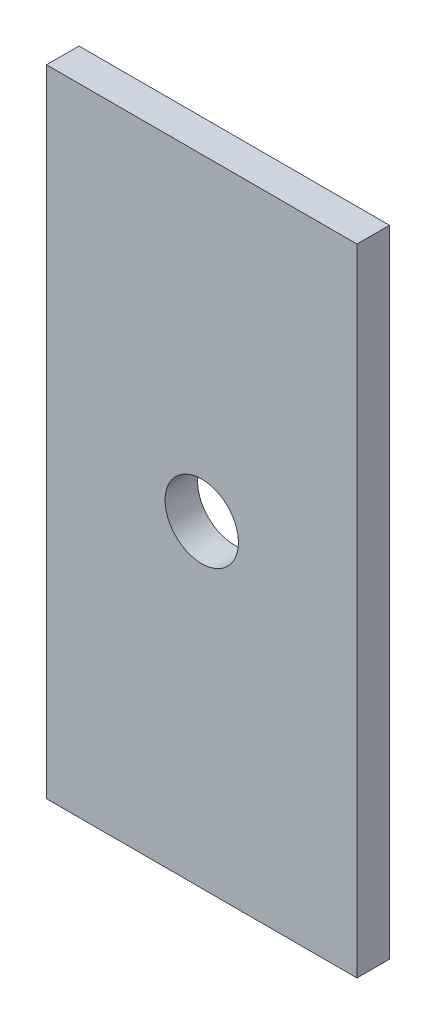
ISO-10303-21;
HEADER;
FILE_DESCRIPTION(('STEP AP214'),'2;1');
FILE_NAME('part.step','',(''),(''),'','','');
FILE_SCHEMA(('AUTOMOTIVE_DESIGN { 1 0 10303 214 1 1 1 1 }'));
ENDSEC;
DATA;
#1=APPLICATION_CONTEXT('core data for automotive mechanical design processes');
#2=APPLICATION_PROTOCOL_DEFINITION('international standard','automotive_design',2000,#1);
#3=PRODUCT_CONTEXT('',#1,'mechanical');
#4=PRODUCT('Part','Part','',(#3));
#5=PRODUCT_RELATED_PRODUCT_CATEGORY('part','',(#4));
#6=PRODUCT_DEFINITION_FORMATION('','',#4);
#7=PRODUCT_DEFINITION_CONTEXT('part definition',#1,'design');
#8=PRODUCT_DEFINITION('design','',#6,#7);
#9=PRODUCT_DEFINITION_SHAPE('','',#8);
#10=(LENGTH_UNIT() NAMED_UNIT(*) SI_UNIT(.MILLI.,.METRE.));
#11=(NAMED_UNIT(*) PLANE_ANGLE_UNIT() SI_UNIT($,.RADIAN.));
#12=(NAMED_UNIT(*) SI_UNIT($,.STERADIAN.) SOLID_ANGLE_UNIT());
#13=UNCERTAINTY_MEASURE_WITH_UNIT(LENGTH_MEASURE(1.E-05),#10,'distance_accuracy_value','');
#14=(GEOMETRIC_REPRESENTATION_CONTEXT(3) GLOBAL_UNCERTAINTY_ASSIGNED_CONTEXT((#13)) GLOBAL_UNIT_ASSIGNED_CONTEXT((#10,
#11,#12)) REPRESENTATION_CONTEXT('',''));
#15=CARTESIAN_POINT('',(0.,0.,0.));
#16=DIRECTION('',(0.,0.,1.));
#17=DIRECTION('',(1.,0.,0.));
#18=AXIS2_PLACEMENT_3D('',#15,#16,#17);
#19=CARTESIAN_POINT('',(0.,0.,2.66));
#20=DIRECTION('',(1.,0.,0.));
#21=DIRECTION('',(0.,1.,0.));
#22=AXIS2_PLACEMENT_3D('',#19,#20,#21);
#23=PLANE('',#22);
#24=DIRECTION('',(0.,-1.,0.));
#25=VECTOR('',#24,1.);
#26=CARTESIAN_POINT('',(0.,0.,0.));
#27=LINE('',#26,#25);
#28=CARTESIAN_POINT('',(0.,52.,0.));
#29=VERTEX_POINT('',#28);
#30=CARTESIAN_POINT('',(0.,0.,0.));
#31=VERTEX_POINT('',#30);
#32=EDGE_CURVE('E106',#29,#31,#27,.T.);
#33=ORIENTED_EDGE('',*,*,#32,.T.);
#34=DIRECTION('',(0.,0.,-1.));
#35=VECTOR('',#34,1.);
#36=CARTESIAN_POINT('',(0.,0.,2.66));
#37=LINE('',#36,#35);
#38=CARTESIAN_POINT('',(0.,0.,2.66));
#39=VERTEX_POINT('',#38);
#40=EDGE_CURVE('E11',#39,#31,#37,.T.);
#41=ORIENTED_EDGE('',*,*,#40,.F.);
#42=DIRECTION('',(0.,-1.,0.));
#43=VECTOR('',#42,1.);
#44=CARTESIAN_POINT('',(0.,0.,2.66));
#45=LINE('',#44,#43);
#46=CARTESIAN_POINT('',(0.,52.,2.66));
#47=VERTEX_POINT('',#46);
#48=EDGE_CURVE('E94',#47,#39,#45,.T.);
#49=ORIENTED_EDGE('',*,*,#48,.F.);
#50=DIRECTION('',(0.,0.,-1.));
#51=VECTOR('',#50,1.);
#52=CARTESIAN_POINT('',(0.,52.,2.66));
#53=LINE('',#52,#51);
#54=EDGE_CURVE('E102',#47,#29,#53,.T.);
#55=ORIENTED_EDGE('',*,*,#54,.T.);
#56=EDGE_LOOP('',(#33,#41,#49,#55));
#57=FACE_BOUND('',#56,.T.);
#58=ADVANCED_FACE('F43',(#57),#23,.F.);
#59=CARTESIAN_POINT('',(0.,0.,2.66));
#60=DIRECTION('',(0.,1.,0.));
#61=DIRECTION('',(0.,0.,1.));
#62=AXIS2_PLACEMENT_3D('',#59,#60,#61);
#63=PLANE('',#62);
#64=DIRECTION('',(1.,0.,0.));
#65=VECTOR('',#64,1.);
#66=CARTESIAN_POINT('',(0.,0.,0.));
#67=LINE('',#66,#65);
#68=CARTESIAN_POINT('',(25.4,0.,0.));
#69=VERTEX_POINT('',#68);
#70=EDGE_CURVE('E98',#31,#69,#67,.T.);
#71=ORIENTED_EDGE('',*,*,#70,.T.);
#72=DIRECTION('',(0.,0.,-1.));
#73=VECTOR('',#72,1.);
#74=CARTESIAN_POINT('',(25.4,0.,2.66));
#75=LINE('',#74,#73);
#76=CARTESIAN_POINT('',(25.4,0.,2.66));
#77=VERTEX_POINT('',#76);
#78=EDGE_CURVE('E51',#77,#69,#75,.T.);
#79=ORIENTED_EDGE('',*,*,#78,.F.);
#80=DIRECTION('',(1.,0.,0.));
#81=VECTOR('',#80,1.);
#82=CARTESIAN_POINT('',(0.,0.,2.66));
#83=LINE('',#82,#81);
#84=EDGE_CURVE('E89',#39,#77,#83,.T.);
#85=ORIENTED_EDGE('',*,*,#84,.F.);
#86=ORIENTED_EDGE('',*,*,#40,.T.);
#87=EDGE_LOOP('',(#71,#79,#85,#86));
#88=FACE_BOUND('',#87,.T.);
#89=ADVANCED_FACE('F97',(#88),#63,.F.);
#90=CARTESIAN_POINT('',(25.4,0.,2.66));
#91=DIRECTION('',(-1.,0.,0.));
#92=DIRECTION('',(0.,-1.,0.));
#93=AXIS2_PLACEMENT_3D('',#90,#91,#92);
#94=PLANE('',#93);
#95=DIRECTION('',(0.,1.,0.));
#96=VECTOR('',#95,1.);
#97=CARTESIAN_POINT('',(25.4,0.,0.));
#98=LINE('',#97,#96);
#99=CARTESIAN_POINT('',(25.4,52.,0.));
#100=VERTEX_POINT('',#99);
#101=EDGE_CURVE('E76',#69,#100,#98,.T.);
#102=ORIENTED_EDGE('',*,*,#101,.T.);
#103=DIRECTION('',(0.,0.,-1.));
#104=VECTOR('',#103,1.);
#105=CARTESIAN_POINT('',(25.4,52.,2.66));
#106=LINE('',#105,#104);
#107=CARTESIAN_POINT('',(25.4,52.,2.66));
#108=VERTEX_POINT('',#107);
#109=EDGE_CURVE('E99',#108,#100,#106,.T.);
#110=ORIENTED_EDGE('',*,*,#109,.F.);
#111=DIRECTION('',(0.,1.,0.));
#112=VECTOR('',#111,1.);
#113=CARTESIAN_POINT('',(25.4,0.,2.66));
#114=LINE('',#113,#112);
#115=EDGE_CURVE('E92',#77,#108,#114,.T.);
#116=ORIENTED_EDGE('',*,*,#115,.F.);
#117=ORIENTED_EDGE('',*,*,#78,.T.);
#118=EDGE_LOOP('',(#102,#110,#116,#117));
#119=FACE_BOUND('',#118,.T.);
#120=ADVANCED_FACE('F100',(#119),#94,.F.);
#121=CARTESIAN_POINT('',(0.,52.,2.66));
#122=DIRECTION('',(0.,-1.,0.));
#123=DIRECTION('',(0.,0.,-1.));
#124=AXIS2_PLACEMENT_3D('',#121,#122,#123);
#125=PLANE('',#124);
#126=DIRECTION('',(-1.,0.,0.));
#127=VECTOR('',#126,1.);
#128=CARTESIAN_POINT('',(0.,52.,0.));
#129=LINE('',#128,#127);
#130=EDGE_CURVE('E82',#100,#29,#129,.T.);
#131=ORIENTED_EDGE('',*,*,#130,.T.);
#132=ORIENTED_EDGE('',*,*,#54,.F.);
#133=DIRECTION('',(-1.,0.,0.));
#134=VECTOR('',#133,1.);
#135=CARTESIAN_POINT('',(0.,52.,2.66));
#136=LINE('',#135,#134);
#137=EDGE_CURVE('E59',#108,#47,#136,.T.);
#138=ORIENTED_EDGE('',*,*,#137,.F.);
#139=ORIENTED_EDGE('',*,*,#109,.T.);
#140=EDGE_LOOP('',(#131,#132,#138,#139));
#141=FACE_BOUND('',#140,.T.);
#142=ADVANCED_FACE('F114',(#141),#125,.F.);
#143=CARTESIAN_POINT('',(0.,0.,2.66));
#144=DIRECTION('',(0.,0.,-1.));
#145=DIRECTION('',(-1.,0.,0.));
#146=AXIS2_PLACEMENT_3D('',#143,#144,#145);
#147=PLANE('',#146);
#148=CARTESIAN_POINT('',(12.7,26.,2.66));
#149=DIRECTION('',(0.,0.,-1.));
#150=DIRECTION('',(-1.,0.,0.));
#151=AXIS2_PLACEMENT_3D('',#148,#149,#150);
#152=CIRCLE('',#151,3.);
#153=CARTESIAN_POINT('',(9.69999999999999,26.,2.66));
#154=VERTEX_POINT('',#153);
#155=EDGE_CURVE('E109',#154,#154,#152,.T.);
#156=ORIENTED_EDGE('',*,*,#155,.T.);
#157=EDGE_LOOP('',(#156));
#158=FACE_BOUND('',#157,.T.);
#159=ORIENTED_EDGE('',*,*,#48,.T.);
#160=ORIENTED_EDGE('',*,*,#84,.T.);
#161=ORIENTED_EDGE('',*,*,#115,.T.);
#162=ORIENTED_EDGE('',*,*,#137,.T.);
#163=EDGE_LOOP('',(#159,#160,#161,#162));
#164=FACE_BOUND('',#163,.T.);
#165=ADVANCED_FACE('F90',(#158,#164),#147,.F.);
#166=CARTESIAN_POINT('',(0.,0.,0.));
#167=DIRECTION('',(0.,0.,-1.));
#168=DIRECTION('',(-1.,0.,0.));
#169=AXIS2_PLACEMENT_3D('',#166,#167,#168);
#170=PLANE('',#169);
#171=CARTESIAN_POINT('',(12.7,26.,0.));
#172=DIRECTION('',(0.,0.,-1.));
#173=DIRECTION('',(-1.,0.,0.));
#174=AXIS2_PLACEMENT_3D('',#171,#172,#173);
#175=CIRCLE('',#174,3.);
#176=CARTESIAN_POINT('',(9.69999999999999,26.,0.));
#177=VERTEX_POINT('',#176);
#178=EDGE_CURVE('E122',#177,#177,#175,.T.);
#179=ORIENTED_EDGE('',*,*,#178,.F.);
#180=EDGE_LOOP('',(#179));
#181=FACE_BOUND('',#180,.T.);
#182=ORIENTED_EDGE('',*,*,#32,.F.);
#183=ORIENTED_EDGE('',*,*,#130,.F.);
#184=ORIENTED_EDGE('',*,*,#101,.F.);
#185=ORIENTED_EDGE('',*,*,#70,.F.);
#186=EDGE_LOOP('',(#182,#183,#184,#185));
#187=FACE_BOUND('',#186,.T.);
#188=ADVANCED_FACE('F117',(#181,#187),#170,.T.);
#189=CARTESIAN_POINT('',(12.7,26.,10.));
#190=DIRECTION('',(0.,0.,-1.));
#191=DIRECTION('',(-1.,0.,0.));
#192=AXIS2_PLACEMENT_3D('',#189,#190,#191);
#193=CYLINDRICAL_SURFACE('',#192,3.);
#194=ORIENTED_EDGE('',*,*,#178,.T.);
#195=EDGE_LOOP('',(#194));
#196=FACE_BOUND('',#195,.T.);
#197=ORIENTED_EDGE('',*,*,#155,.F.);
#198=EDGE_LOOP('',(#197));
#199=FACE_BOUND('',#198,.T.);
#200=ADVANCED_FACE('F126',(#196,#199),#193,.F.);
#201=CLOSED_SHELL('',(#58,#89,#120,#142,#165,#188,#200));
#202=MANIFOLD_SOLID_BREP('B2',#201);
#203=ADVANCED_BREP_SHAPE_REPRESENTATION('',(#18,#202),#14);
#204=SHAPE_DEFINITION_REPRESENTATION(#9,#203);
ENDSEC;
END-ISO-10303-21;
